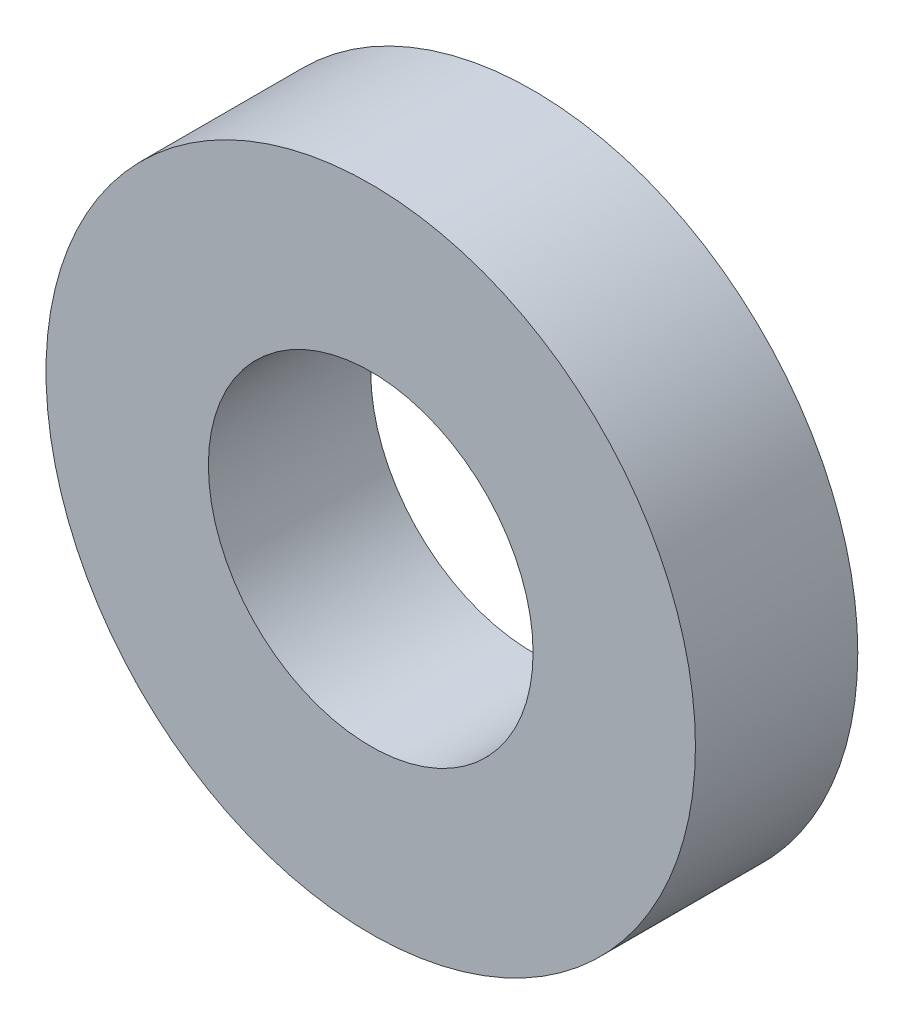
ISO-10303-21;
HEADER;
FILE_DESCRIPTION(('STEP AP214'),'2;1');
FILE_NAME('part.step','',(''),(''),'','','');
FILE_SCHEMA(('AUTOMOTIVE_DESIGN { 1 0 10303 214 1 1 1 1 }'));
ENDSEC;
DATA;
#1=APPLICATION_CONTEXT('core data for automotive mechanical design processes');
#2=APPLICATION_PROTOCOL_DEFINITION('international standard','automotive_design',2000,#1);
#3=PRODUCT_CONTEXT('',#1,'mechanical');
#4=PRODUCT('Part','Part','',(#3));
#5=PRODUCT_RELATED_PRODUCT_CATEGORY('part','',(#4));
#6=PRODUCT_DEFINITION_FORMATION('','',#4);
#7=PRODUCT_DEFINITION_CONTEXT('part definition',#1,'design');
#8=PRODUCT_DEFINITION('design','',#6,#7);
#9=PRODUCT_DEFINITION_SHAPE('','',#8);
#10=(LENGTH_UNIT() NAMED_UNIT(*) SI_UNIT(.MILLI.,.METRE.));
#11=(NAMED_UNIT(*) PLANE_ANGLE_UNIT() SI_UNIT($,.RADIAN.));
#12=(NAMED_UNIT(*) SI_UNIT($,.STERADIAN.) SOLID_ANGLE_UNIT());
#13=UNCERTAINTY_MEASURE_WITH_UNIT(LENGTH_MEASURE(1.E-05),#10,'distance_accuracy_value','');
#14=(GEOMETRIC_REPRESENTATION_CONTEXT(3) GLOBAL_UNCERTAINTY_ASSIGNED_CONTEXT((#13)) GLOBAL_UNIT_ASSIGNED_CONTEXT((#10,
#11,#12)) REPRESENTATION_CONTEXT('',''));
#15=CARTESIAN_POINT('',(0.,0.,0.));
#16=DIRECTION('',(0.,0.,1.));
#17=DIRECTION('',(1.,0.,0.));
#18=AXIS2_PLACEMENT_3D('',#15,#16,#17);
#19=CARTESIAN_POINT('',(0.,0.,3.));
#20=DIRECTION('',(0.,0.,1.));
#21=DIRECTION('',(1.,0.,0.));
#22=AXIS2_PLACEMENT_3D('',#19,#20,#21);
#23=PLANE('',#22);
#24=CARTESIAN_POINT('',(0.,0.,3.));
#25=DIRECTION('',(0.,0.,1.));
#26=DIRECTION('',(1.,0.,0.));
#27=AXIS2_PLACEMENT_3D('',#24,#25,#26);
#28=CIRCLE('',#27,6.);
#29=CARTESIAN_POINT('',(6.,0.,3.));
#30=VERTEX_POINT('',#29);
#31=EDGE_CURVE('E10',#30,#30,#28,.T.);
#32=ORIENTED_EDGE('',*,*,#31,.T.);
#33=EDGE_LOOP('',(#32));
#34=FACE_BOUND('',#33,.T.);
#35=CARTESIAN_POINT('',(0.,0.,3.));
#36=DIRECTION('',(0.,0.,1.));
#37=DIRECTION('',(1.,0.,0.));
#38=AXIS2_PLACEMENT_3D('',#35,#36,#37);
#39=CIRCLE('',#38,3.);
#40=CARTESIAN_POINT('',(3.,0.,3.));
#41=VERTEX_POINT('',#40);
#42=EDGE_CURVE('E48',#41,#41,#39,.T.);
#43=ORIENTED_EDGE('',*,*,#42,.F.);
#44=EDGE_LOOP('',(#43));
#45=FACE_BOUND('',#44,.T.);
#46=ADVANCED_FACE('F37',(#34,#45),#23,.T.);
#47=CARTESIAN_POINT('',(0.,0.,0.));
#48=DIRECTION('',(0.,0.,1.));
#49=DIRECTION('',(1.,0.,0.));
#50=AXIS2_PLACEMENT_3D('',#47,#48,#49);
#51=PLANE('',#50);
#52=CARTESIAN_POINT('',(0.,0.,0.));
#53=DIRECTION('',(0.,0.,1.));
#54=DIRECTION('',(1.,0.,0.));
#55=AXIS2_PLACEMENT_3D('',#52,#53,#54);
#56=CIRCLE('',#55,6.);
#57=CARTESIAN_POINT('',(6.,0.,0.));
#58=VERTEX_POINT('',#57);
#59=EDGE_CURVE('E41',#58,#58,#56,.T.);
#60=ORIENTED_EDGE('',*,*,#59,.F.);
#61=EDGE_LOOP('',(#60));
#62=FACE_BOUND('',#61,.T.);
#63=CARTESIAN_POINT('',(0.,0.,0.));
#64=DIRECTION('',(0.,0.,1.));
#65=DIRECTION('',(1.,0.,0.));
#66=AXIS2_PLACEMENT_3D('',#63,#64,#65);
#67=CIRCLE('',#66,3.);
#68=CARTESIAN_POINT('',(3.,0.,0.));
#69=VERTEX_POINT('',#68);
#70=EDGE_CURVE('E50',#69,#69,#67,.T.);
#71=ORIENTED_EDGE('',*,*,#70,.T.);
#72=EDGE_LOOP('',(#71));
#73=FACE_BOUND('',#72,.T.);
#74=ADVANCED_FACE('F60',(#62,#73),#51,.F.);
#75=CARTESIAN_POINT('',(0.,0.,3.));
#76=DIRECTION('',(0.,0.,-1.));
#77=DIRECTION('',(-1.,0.,0.));
#78=AXIS2_PLACEMENT_3D('',#75,#76,#77);
#79=CYLINDRICAL_SURFACE('',#78,6.);
#80=ORIENTED_EDGE('',*,*,#31,.F.);
#81=EDGE_LOOP('',(#80));
#82=FACE_BOUND('',#81,.T.);
#83=ORIENTED_EDGE('',*,*,#59,.T.);
#84=EDGE_LOOP('',(#83));
#85=FACE_BOUND('',#84,.T.);
#86=ADVANCED_FACE('F39',(#82,#85),#79,.T.);
#87=CARTESIAN_POINT('',(0.,0.,3.));
#88=DIRECTION('',(0.,0.,-1.));
#89=DIRECTION('',(-1.,0.,0.));
#90=AXIS2_PLACEMENT_3D('',#87,#88,#89);
#91=CYLINDRICAL_SURFACE('',#90,3.);
#92=ORIENTED_EDGE('',*,*,#42,.T.);
#93=EDGE_LOOP('',(#92));
#94=FACE_BOUND('',#93,.T.);
#95=ORIENTED_EDGE('',*,*,#70,.F.);
#96=EDGE_LOOP('',(#95));
#97=FACE_BOUND('',#96,.T.);
#98=ADVANCED_FACE('F56',(#94,#97),#91,.F.);
#99=CLOSED_SHELL('',(#46,#74,#86,#98));
#100=MANIFOLD_SOLID_BREP('B2',#99);
#101=ADVANCED_BREP_SHAPE_REPRESENTATION('',(#18,#100),#14);
#102=SHAPE_DEFINITION_REPRESENTATION(#9,#101);
ENDSEC;
END-ISO-10303-21;
